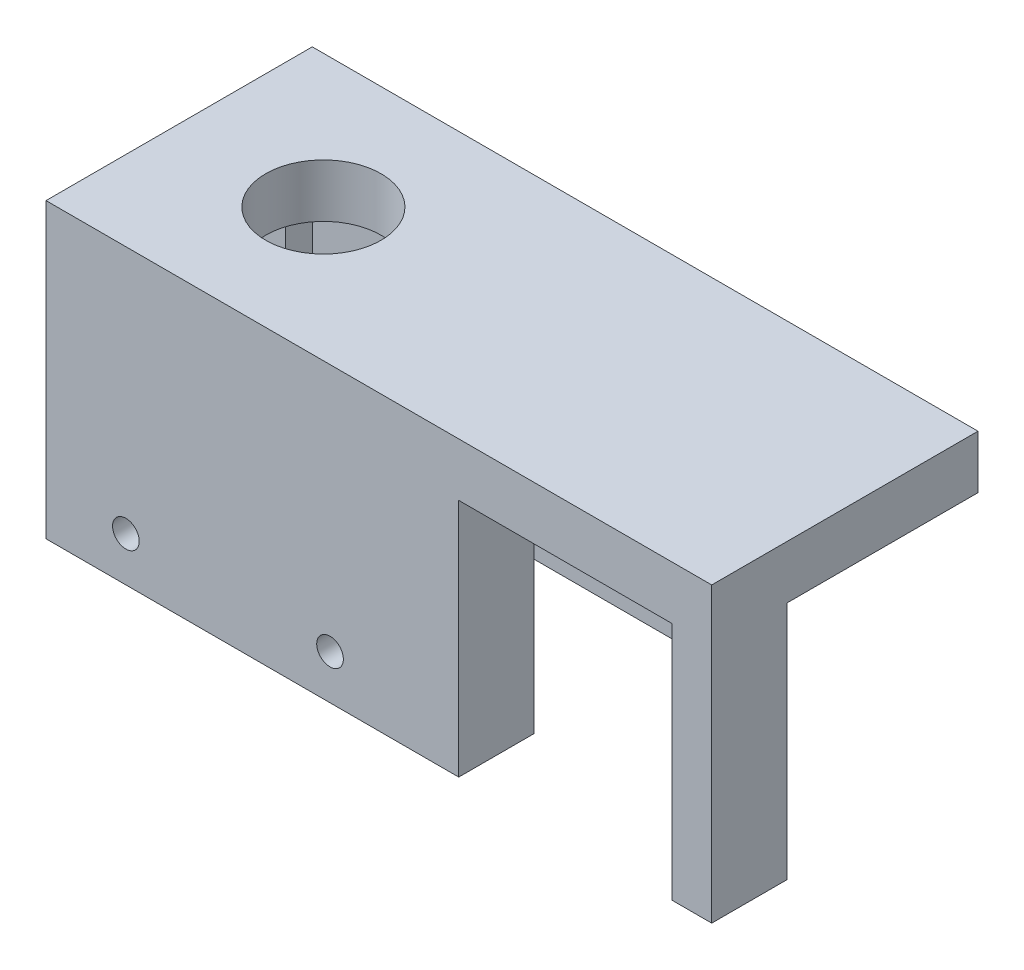
ISO-10303-21;
HEADER;
FILE_DESCRIPTION(('STEP AP214'),'2;1');
FILE_NAME('part.step','',(''),(''),'','','');
FILE_SCHEMA(('AUTOMOTIVE_DESIGN { 1 0 10303 214 1 1 1 1 }'));
ENDSEC;
DATA;
#1=APPLICATION_CONTEXT('core data for automotive mechanical design processes');
#2=APPLICATION_PROTOCOL_DEFINITION('international standard','automotive_design',2000,#1);
#3=PRODUCT_CONTEXT('',#1,'mechanical');
#4=PRODUCT('Part','Part','',(#3));
#5=PRODUCT_RELATED_PRODUCT_CATEGORY('part','',(#4));
#6=PRODUCT_DEFINITION_FORMATION('','',#4);
#7=PRODUCT_DEFINITION_CONTEXT('part definition',#1,'design');
#8=PRODUCT_DEFINITION('design','',#6,#7);
#9=PRODUCT_DEFINITION_SHAPE('','',#8);
#10=(LENGTH_UNIT() NAMED_UNIT(*) SI_UNIT(.MILLI.,.METRE.));
#11=(NAMED_UNIT(*) PLANE_ANGLE_UNIT() SI_UNIT($,.RADIAN.));
#12=(NAMED_UNIT(*) SI_UNIT($,.STERADIAN.) SOLID_ANGLE_UNIT());
#13=UNCERTAINTY_MEASURE_WITH_UNIT(LENGTH_MEASURE(1.E-05),#10,'distance_accuracy_value','');
#14=(GEOMETRIC_REPRESENTATION_CONTEXT(3) GLOBAL_UNCERTAINTY_ASSIGNED_CONTEXT((#13)) GLOBAL_UNIT_ASSIGNED_CONTEXT((#10,
#11,#12)) REPRESENTATION_CONTEXT('',''));
#15=CARTESIAN_POINT('',(0.,0.,0.));
#16=DIRECTION('',(0.,0.,1.));
#17=DIRECTION('',(1.,0.,0.));
#18=AXIS2_PLACEMENT_3D('',#15,#16,#17);
#19=CARTESIAN_POINT('',(0.,-37.342044014566,0.));
#20=DIRECTION('',(0.,1.,0.));
#21=DIRECTION('',(-1.,0.,0.));
#22=AXIS2_PLACEMENT_3D('',#19,#20,#21);
#23=PLANE('',#22);
#24=DIRECTION('',(0.,0.,1.));
#25=VECTOR('',#24,1.);
#26=CARTESIAN_POINT('',(-82.0695949332075,-37.342044014566,-1.79960881896023));
#27=LINE('',#26,#25);
#28=CARTESIAN_POINT('',(-82.0695949332075,-37.342044014566,2.70039118103977));
#29=VERTEX_POINT('',#28);
#30=CARTESIAN_POINT('',(-82.0695949332075,-37.342044014566,5.70039118103978));
#31=VERTEX_POINT('',#30);
#32=EDGE_CURVE('E304',#29,#31,#27,.T.);
#33=ORIENTED_EDGE('',*,*,#32,.T.);
#34=DIRECTION('',(-1.,0.,0.));
#35=VECTOR('',#34,1.);
#36=CARTESIAN_POINT('',(-81.5695949332076,-37.342044014566,5.70039118103978));
#37=LINE('',#36,#35);
#38=CARTESIAN_POINT('',(-86.5695949332075,-37.342044014566,5.70039118103978));
#39=VERTEX_POINT('',#38);
#40=EDGE_CURVE('E287',#31,#39,#37,.T.);
#41=ORIENTED_EDGE('',*,*,#40,.T.);
#42=DIRECTION('',(0.,0.,1.));
#43=VECTOR('',#42,1.);
#44=CARTESIAN_POINT('',(-86.5695949332075,-37.342044014566,-1.79960881896023));
#45=LINE('',#44,#43);
#46=CARTESIAN_POINT('',(-86.5695949332075,-37.342044014566,-1.79960881896023));
#47=VERTEX_POINT('',#46);
#48=EDGE_CURVE('E301',#47,#39,#45,.T.);
#49=ORIENTED_EDGE('',*,*,#48,.F.);
#50=DIRECTION('',(1.,0.,0.));
#51=VECTOR('',#50,1.);
#52=CARTESIAN_POINT('',(-86.5695949332075,-37.342044014566,-1.79960881896023));
#53=LINE('',#52,#51);
#54=CARTESIAN_POINT('',(-38.5695949332075,-37.342044014566,-1.79960881896022));
#55=VERTEX_POINT('',#54);
#56=EDGE_CURVE('E330',#47,#55,#53,.T.);
#57=ORIENTED_EDGE('',*,*,#56,.T.);
#58=DIRECTION('',(0.,0.,1.));
#59=VECTOR('',#58,1.);
#60=CARTESIAN_POINT('',(-38.5695949332075,-37.342044014566,-1.79960881896022));
#61=LINE('',#60,#59);
#62=CARTESIAN_POINT('',(-38.5695949332075,-37.342044014566,2.70039118103978));
#63=VERTEX_POINT('',#62);
#64=EDGE_CURVE('E540',#55,#63,#61,.T.);
#65=ORIENTED_EDGE('',*,*,#64,.T.);
#66=DIRECTION('',(1.,0.,0.));
#67=VECTOR('',#66,1.);
#68=CARTESIAN_POINT('',(-86.5695949332075,-37.342044014566,2.70039118103977));
#69=LINE('',#68,#67);
#70=EDGE_CURVE('E334',#29,#63,#69,.T.);
#71=ORIENTED_EDGE('',*,*,#70,.F.);
#72=EDGE_LOOP('',(#33,#41,#49,#57,#65,#71));
#73=FACE_BOUND('',#72,.T.);
#74=ADVANCED_FACE('F134',(#73),#23,.F.);
#75=CARTESIAN_POINT('',(-11.5695949332076,-10.342044014566,28.2003911810398));
#76=DIRECTION('',(1.,0.,0.));
#77=DIRECTION('',(0.,1.,0.));
#78=AXIS2_PLACEMENT_3D('',#75,#76,#77);
#79=PLANE('',#78);
#80=DIRECTION('',(0.,0.,-1.));
#81=VECTOR('',#80,1.);
#82=CARTESIAN_POINT('',(-11.5695949332076,-4.342044014566,28.2003911810398));
#83=LINE('',#82,#81);
#84=CARTESIAN_POINT('',(-11.5695949332076,-4.342044014566,28.2003911810398));
#85=VERTEX_POINT('',#84);
#86=CARTESIAN_POINT('',(-11.5695949332076,-4.342044014566,-1.79960881896022));
#87=VERTEX_POINT('',#86);
#88=EDGE_CURVE('E384',#85,#87,#83,.T.);
#89=ORIENTED_EDGE('',*,*,#88,.F.);
#90=DIRECTION('',(0.,1.,0.));
#91=VECTOR('',#90,1.);
#92=CARTESIAN_POINT('',(-11.5695949332076,-10.342044014566,28.2003911810398));
#93=LINE('',#92,#91);
#94=CARTESIAN_POINT('',(-11.5695949332075,-37.342044014566,28.2003911810398));
#95=VERTEX_POINT('',#94);
#96=EDGE_CURVE('E416',#95,#85,#93,.T.);
#97=ORIENTED_EDGE('',*,*,#96,.F.);
#98=DIRECTION('',(0.,0.,-1.));
#99=VECTOR('',#98,1.);
#100=CARTESIAN_POINT('',(-11.5695949332075,-37.342044014566,28.2003911810398));
#101=LINE('',#100,#99);
#102=CARTESIAN_POINT('',(-11.5695949332075,-37.342044014566,19.7003911810398));
#103=VERTEX_POINT('',#102);
#104=EDGE_CURVE('E368',#95,#103,#101,.T.);
#105=ORIENTED_EDGE('',*,*,#104,.T.);
#106=DIRECTION('',(0.,1.,0.));
#107=VECTOR('',#106,1.);
#108=CARTESIAN_POINT('',(-11.5695949332075,-37.342044014566,19.7003911810398));
#109=LINE('',#108,#107);
#110=CARTESIAN_POINT('',(-11.5695949332076,-10.342044014566,19.7003911810398));
#111=VERTEX_POINT('',#110);
#112=EDGE_CURVE('E380',#103,#111,#109,.T.);
#113=ORIENTED_EDGE('',*,*,#112,.T.);
#114=DIRECTION('',(0.,0.,-1.));
#115=VECTOR('',#114,1.);
#116=CARTESIAN_POINT('',(-11.5695949332076,-10.342044014566,28.2003911810398));
#117=LINE('',#116,#115);
#118=CARTESIAN_POINT('',(-11.5695949332076,-10.342044014566,-1.79960881896022));
#119=VERTEX_POINT('',#118);
#120=EDGE_CURVE('E392',#111,#119,#117,.T.);
#121=ORIENTED_EDGE('',*,*,#120,.T.);
#122=DIRECTION('',(0.,1.,0.));
#123=VECTOR('',#122,1.);
#124=CARTESIAN_POINT('',(-11.5695949332076,-10.342044014566,-1.79960881896022));
#125=LINE('',#124,#123);
#126=EDGE_CURVE('E403',#119,#87,#125,.T.);
#127=ORIENTED_EDGE('',*,*,#126,.T.);
#128=EDGE_LOOP('',(#89,#97,#105,#113,#121,#127));
#129=FACE_BOUND('',#128,.T.);
#130=ADVANCED_FACE('F136',(#129),#79,.T.);
#131=CARTESIAN_POINT('',(-11.5695949332076,-10.342044014566,28.2003911810398));
#132=DIRECTION('',(0.,0.,-1.));
#133=DIRECTION('',(-1.,0.,0.));
#134=AXIS2_PLACEMENT_3D('',#131,#132,#133);
#135=PLANE('',#134);
#136=CARTESIAN_POINT('',(-54.5695949332075,-32.342044014566,28.2003911810398));
#137=DIRECTION('',(0.,0.,1.));
#138=DIRECTION('',(1.,0.,0.));
#139=AXIS2_PLACEMENT_3D('',#136,#137,#138);
#140=CIRCLE('',#139,1.5);
#141=CARTESIAN_POINT('',(-53.0695949332075,-32.342044014566,28.2003911810398));
#142=VERTEX_POINT('',#141);
#143=EDGE_CURVE('E438',#142,#142,#140,.T.);
#144=ORIENTED_EDGE('',*,*,#143,.F.);
#145=EDGE_LOOP('',(#144));
#146=FACE_BOUND('',#145,.T.);
#147=CARTESIAN_POINT('',(-77.5695949332075,-32.342044014566,28.2003911810398));
#148=DIRECTION('',(0.,0.,1.));
#149=DIRECTION('',(1.,0.,0.));
#150=AXIS2_PLACEMENT_3D('',#147,#148,#149);
#151=CIRCLE('',#150,1.5);
#152=CARTESIAN_POINT('',(-76.0695949332075,-32.342044014566,28.2003911810398));
#153=VERTEX_POINT('',#152);
#154=EDGE_CURVE('E433',#153,#153,#151,.T.);
#155=ORIENTED_EDGE('',*,*,#154,.F.);
#156=EDGE_LOOP('',(#155));
#157=FACE_BOUND('',#156,.T.);
#158=DIRECTION('',(-1.,0.,0.));
#159=VECTOR('',#158,1.);
#160=CARTESIAN_POINT('',(-11.5695949332076,-4.342044014566,28.2003911810398));
#161=LINE('',#160,#159);
#162=CARTESIAN_POINT('',(-86.5695949332076,-4.34204401456603,28.2003911810398));
#163=VERTEX_POINT('',#162);
#164=EDGE_CURVE('E396',#85,#163,#161,.T.);
#165=ORIENTED_EDGE('',*,*,#164,.T.);
#166=DIRECTION('',(0.,1.,0.));
#167=VECTOR('',#166,1.);
#168=CARTESIAN_POINT('',(-86.5695949332076,-10.342044014566,28.2003911810398));
#169=LINE('',#168,#167);
#170=CARTESIAN_POINT('',(-86.5695949332075,-37.342044014566,28.2003911810398));
#171=VERTEX_POINT('',#170);
#172=EDGE_CURVE('E420',#171,#163,#169,.T.);
#173=ORIENTED_EDGE('',*,*,#172,.F.);
#174=DIRECTION('',(1.,0.,0.));
#175=VECTOR('',#174,1.);
#176=CARTESIAN_POINT('',(-86.5695949332075,-37.342044014566,28.2003911810398));
#177=LINE('',#176,#175);
#178=CARTESIAN_POINT('',(-40.0695949332075,-37.342044014566,28.2003911810398));
#179=VERTEX_POINT('',#178);
#180=EDGE_CURVE('E343',#171,#179,#177,.T.);
#181=ORIENTED_EDGE('',*,*,#180,.T.);
#182=DIRECTION('',(0.,1.,0.));
#183=VECTOR('',#182,1.);
#184=CARTESIAN_POINT('',(-40.0695949332075,-37.342044014566,28.2003911810398));
#185=LINE('',#184,#183);
#186=CARTESIAN_POINT('',(-40.0695949332076,-10.342044014566,28.2003911810398));
#187=VERTEX_POINT('',#186);
#188=EDGE_CURVE('E339',#179,#187,#185,.T.);
#189=ORIENTED_EDGE('',*,*,#188,.T.);
#190=DIRECTION('',(-1.,0.,0.));
#191=VECTOR('',#190,1.);
#192=CARTESIAN_POINT('',(-11.5695949332076,-10.342044014566,28.2003911810398));
#193=LINE('',#192,#191);
#194=CARTESIAN_POINT('',(-16.0695949332076,-10.342044014566,28.2003911810398));
#195=VERTEX_POINT('',#194);
#196=EDGE_CURVE('E400',#195,#187,#193,.T.);
#197=ORIENTED_EDGE('',*,*,#196,.F.);
#198=DIRECTION('',(0.,1.,0.));
#199=VECTOR('',#198,1.);
#200=CARTESIAN_POINT('',(-16.0695949332075,-37.342044014566,28.2003911810398));
#201=LINE('',#200,#199);
#202=CARTESIAN_POINT('',(-16.0695949332075,-37.342044014566,28.2003911810398));
#203=VERTEX_POINT('',#202);
#204=EDGE_CURVE('E385',#203,#195,#201,.T.);
#205=ORIENTED_EDGE('',*,*,#204,.F.);
#206=DIRECTION('',(-1.,0.,0.));
#207=VECTOR('',#206,1.);
#208=CARTESIAN_POINT('',(-11.5695949332075,-37.342044014566,28.2003911810398));
#209=LINE('',#208,#207);
#210=EDGE_CURVE('E365',#95,#203,#209,.T.);
#211=ORIENTED_EDGE('',*,*,#210,.F.);
#212=ORIENTED_EDGE('',*,*,#96,.T.);
#213=EDGE_LOOP('',(#165,#173,#181,#189,#197,#205,#211,#212));
#214=FACE_BOUND('',#213,.T.);
#215=ADVANCED_FACE('F584',(#146,#157,#214),#135,.F.);
#216=CARTESIAN_POINT('',(-86.5695949332076,-10.342044014566,28.2003911810398));
#217=DIRECTION('',(1.,0.,0.));
#218=DIRECTION('',(0.,1.,0.));
#219=AXIS2_PLACEMENT_3D('',#216,#217,#218);
#220=PLANE('',#219);
#221=ORIENTED_EDGE('',*,*,#48,.T.);
#222=DIRECTION('',(0.,-1.,0.));
#223=VECTOR('',#222,1.);
#224=CARTESIAN_POINT('',(-86.5695949332075,-37.342044014566,5.70039118103978));
#225=LINE('',#224,#223);
#226=CARTESIAN_POINT('',(-86.5695949332076,-11.342044014566,5.70039118103977));
#227=VERTEX_POINT('',#226);
#228=EDGE_CURVE('E284',#227,#39,#225,.T.);
#229=ORIENTED_EDGE('',*,*,#228,.F.);
#230=DIRECTION('',(0.,0.,-1.));
#231=VECTOR('',#230,1.);
#232=CARTESIAN_POINT('',(-86.5695949332076,-11.342044014566,5.70039118103977));
#233=LINE('',#232,#231);
#234=CARTESIAN_POINT('',(-86.5695949332076,-11.342044014566,20.7003911810398));
#235=VERTEX_POINT('',#234);
#236=EDGE_CURVE('E307',#235,#227,#233,.T.);
#237=ORIENTED_EDGE('',*,*,#236,.F.);
#238=DIRECTION('',(0.,1.,0.));
#239=VECTOR('',#238,1.);
#240=CARTESIAN_POINT('',(-86.5695949332075,-37.342044014566,20.7003911810398));
#241=LINE('',#240,#239);
#242=CARTESIAN_POINT('',(-86.5695949332075,-37.342044014566,20.7003911810398));
#243=VERTEX_POINT('',#242);
#244=EDGE_CURVE('E295',#243,#235,#241,.T.);
#245=ORIENTED_EDGE('',*,*,#244,.F.);
#246=EDGE_CURVE('E315',#243,#171,#45,.T.);
#247=ORIENTED_EDGE('',*,*,#246,.T.);
#248=ORIENTED_EDGE('',*,*,#172,.T.);
#249=DIRECTION('',(0.,0.,-1.));
#250=VECTOR('',#249,1.);
#251=CARTESIAN_POINT('',(-86.5695949332076,-4.34204401456603,28.2003911810398));
#252=LINE('',#251,#250);
#253=CARTESIAN_POINT('',(-86.5695949332076,-4.34204401456603,-1.79960881896023));
#254=VERTEX_POINT('',#253);
#255=EDGE_CURVE('E411',#163,#254,#252,.T.);
#256=ORIENTED_EDGE('',*,*,#255,.T.);
#257=DIRECTION('',(0.,1.,0.));
#258=VECTOR('',#257,1.);
#259=CARTESIAN_POINT('',(-86.5695949332076,-10.342044014566,-1.79960881896023));
#260=LINE('',#259,#258);
#261=EDGE_CURVE('E311',#47,#254,#260,.T.);
#262=ORIENTED_EDGE('',*,*,#261,.F.);
#263=EDGE_LOOP('',(#221,#229,#237,#245,#247,#248,#256,#262));
#264=FACE_BOUND('',#263,.T.);
#265=ADVANCED_FACE('F309',(#264),#220,.F.);
#266=CARTESIAN_POINT('',(-11.5695949332076,-10.342044014566,-1.79960881896022));
#267=DIRECTION('',(0.,0.,-1.));
#268=DIRECTION('',(-1.,0.,0.));
#269=AXIS2_PLACEMENT_3D('',#266,#267,#268);
#270=PLANE('',#269);
#271=CARTESIAN_POINT('',(-77.5695949332075,-32.342044014566,-1.79960881896022));
#272=DIRECTION('',(0.,0.,-1.));
#273=DIRECTION('',(-1.,0.,0.));
#274=AXIS2_PLACEMENT_3D('',#271,#272,#273);
#275=CIRCLE('',#274,1.5);
#276=CARTESIAN_POINT('',(-79.0695949332075,-32.342044014566,-1.79960881896022));
#277=VERTEX_POINT('',#276);
#278=EDGE_CURVE('E466',#277,#277,#275,.T.);
#279=ORIENTED_EDGE('',*,*,#278,.F.);
#280=EDGE_LOOP('',(#279));
#281=FACE_BOUND('',#280,.T.);
#282=DIRECTION('',(-1.,0.,0.));
#283=VECTOR('',#282,1.);
#284=CARTESIAN_POINT('',(-11.5695949332076,-4.342044014566,-1.79960881896022));
#285=LINE('',#284,#283);
#286=EDGE_CURVE('E407',#87,#254,#285,.T.);
#287=ORIENTED_EDGE('',*,*,#286,.F.);
#288=ORIENTED_EDGE('',*,*,#126,.F.);
#289=DIRECTION('',(-1.,0.,0.));
#290=VECTOR('',#289,1.);
#291=CARTESIAN_POINT('',(-11.5695949332076,-10.342044014566,-1.79960881896022));
#292=LINE('',#291,#290);
#293=CARTESIAN_POINT('',(-38.5695949332075,-10.342044014566,-1.79960881896022));
#294=VERTEX_POINT('',#293);
#295=EDGE_CURVE('E395',#119,#294,#292,.T.);
#296=ORIENTED_EDGE('',*,*,#295,.T.);
#297=DIRECTION('',(0.,1.,0.));
#298=VECTOR('',#297,1.);
#299=CARTESIAN_POINT('',(-38.5695949332075,-37.342044014566,-1.79960881896022));
#300=LINE('',#299,#298);
#301=EDGE_CURVE('E326',#55,#294,#300,.T.);
#302=ORIENTED_EDGE('',*,*,#301,.F.);
#303=ORIENTED_EDGE('',*,*,#56,.F.);
#304=ORIENTED_EDGE('',*,*,#261,.T.);
#305=EDGE_LOOP('',(#287,#288,#296,#302,#303,#304));
#306=FACE_BOUND('',#305,.T.);
#307=ADVANCED_FACE('F611',(#281,#306),#270,.T.);
#308=CARTESIAN_POINT('',(0.,-10.342044014566,0.));
#309=DIRECTION('',(0.,1.,0.));
#310=DIRECTION('',(-1.,0.,0.));
#311=AXIS2_PLACEMENT_3D('',#308,#309,#310);
#312=PLANE('',#311);
#313=CARTESIAN_POINT('',(-70.3195949332076,-10.342044014566,13.2003911810398));
#314=DIRECTION('',(0.,1.,0.));
#315=DIRECTION('',(-1.,0.,0.));
#316=AXIS2_PLACEMENT_3D('',#313,#314,#315);
#317=CIRCLE('',#316,6.5);
#318=CARTESIAN_POINT('',(-76.8195949332076,-10.342044014566,13.2003911810398));
#319=VERTEX_POINT('',#318);
#320=EDGE_CURVE('E474',#319,#319,#317,.T.);
#321=ORIENTED_EDGE('',*,*,#320,.T.);
#322=EDGE_LOOP('',(#321));
#323=FACE_BOUND('',#322,.T.);
#324=ORIENTED_EDGE('',*,*,#196,.T.);
#325=DIRECTION('',(0.,0.,-1.));
#326=VECTOR('',#325,1.);
#327=CARTESIAN_POINT('',(-40.0695949332075,-10.342044014566,28.2003911810398));
#328=LINE('',#327,#326);
#329=CARTESIAN_POINT('',(-40.0695949332075,-10.342044014566,19.7003911810398));
#330=VERTEX_POINT('',#329);
#331=EDGE_CURVE('E519',#187,#330,#328,.T.);
#332=ORIENTED_EDGE('',*,*,#331,.T.);
#333=DIRECTION('',(1.,0.,0.));
#334=VECTOR('',#333,1.);
#335=CARTESIAN_POINT('',(-46.0695949332076,-10.342044014566,19.7003911810398));
#336=LINE('',#335,#334);
#337=CARTESIAN_POINT('',(-46.0695949332076,-10.342044014566,19.7003911810398));
#338=VERTEX_POINT('',#337);
#339=EDGE_CURVE('E376',#338,#330,#336,.T.);
#340=ORIENTED_EDGE('',*,*,#339,.F.);
#341=DIRECTION('',(0.,0.,-1.));
#342=VECTOR('',#341,1.);
#343=CARTESIAN_POINT('',(-46.0695949332076,-10.342044014566,28.2003911810398));
#344=LINE('',#343,#342);
#345=CARTESIAN_POINT('',(-46.0695949332076,-10.342044014566,23.7003911810398));
#346=VERTEX_POINT('',#345);
#347=EDGE_CURVE('E515',#346,#338,#344,.T.);
#348=ORIENTED_EDGE('',*,*,#347,.F.);
#349=DIRECTION('',(1.,0.,0.));
#350=VECTOR('',#349,1.);
#351=CARTESIAN_POINT('',(-86.5695949332076,-10.342044014566,23.7003911810398));
#352=LINE('',#351,#350);
#353=CARTESIAN_POINT('',(-82.0695949332076,-10.342044014566,23.7003911810398));
#354=VERTEX_POINT('',#353);
#355=EDGE_CURVE('E345',#354,#346,#352,.T.);
#356=ORIENTED_EDGE('',*,*,#355,.F.);
#357=DIRECTION('',(0.,0.,1.));
#358=VECTOR('',#357,1.);
#359=CARTESIAN_POINT('',(-82.0695949332076,-10.342044014566,-1.79960881896023));
#360=LINE('',#359,#358);
#361=CARTESIAN_POINT('',(-82.0695949332076,-10.342044014566,2.70039118103977));
#362=VERTEX_POINT('',#361);
#363=EDGE_CURVE('E322',#362,#354,#360,.T.);
#364=ORIENTED_EDGE('',*,*,#363,.F.);
#365=DIRECTION('',(1.,0.,0.));
#366=VECTOR('',#365,1.);
#367=CARTESIAN_POINT('',(-86.5695949332076,-10.342044014566,2.70039118103977));
#368=LINE('',#367,#366);
#369=CARTESIAN_POINT('',(-43.5695949332075,-10.342044014566,2.70039118103978));
#370=VERTEX_POINT('',#369);
#371=EDGE_CURVE('E320',#362,#370,#368,.T.);
#372=ORIENTED_EDGE('',*,*,#371,.T.);
#373=DIRECTION('',(0.,0.,1.));
#374=VECTOR('',#373,1.);
#375=CARTESIAN_POINT('',(-43.5695949332075,-10.342044014566,-1.79960881896022));
#376=LINE('',#375,#374);
#377=CARTESIAN_POINT('',(-43.5695949332075,-10.342044014566,7.20039118103978));
#378=VERTEX_POINT('',#377);
#379=EDGE_CURVE('E545',#370,#378,#376,.T.);
#380=ORIENTED_EDGE('',*,*,#379,.T.);
#381=DIRECTION('',(-1.,0.,0.));
#382=VECTOR('',#381,1.);
#383=CARTESIAN_POINT('',(-38.5695949332075,-10.342044014566,7.20039118103978));
#384=LINE('',#383,#382);
#385=CARTESIAN_POINT('',(-38.5695949332075,-10.342044014566,7.20039118103978));
#386=VERTEX_POINT('',#385);
#387=EDGE_CURVE('E510',#386,#378,#384,.T.);
#388=ORIENTED_EDGE('',*,*,#387,.F.);
#389=DIRECTION('',(0.,0.,1.));
#390=VECTOR('',#389,1.);
#391=CARTESIAN_POINT('',(-38.5695949332075,-10.342044014566,-1.79960881896022));
#392=LINE('',#391,#390);
#393=EDGE_CURVE('E541',#294,#386,#392,.T.);
#394=ORIENTED_EDGE('',*,*,#393,.F.);
#395=ORIENTED_EDGE('',*,*,#295,.F.);
#396=ORIENTED_EDGE('',*,*,#120,.F.);
#397=DIRECTION('',(-1.,0.,0.));
#398=VECTOR('',#397,1.);
#399=CARTESIAN_POINT('',(-11.5695949332076,-10.342044014566,19.7003911810398));
#400=LINE('',#399,#398);
#401=CARTESIAN_POINT('',(-16.0695949332076,-10.342044014566,19.7003911810398));
#402=VERTEX_POINT('',#401);
#403=EDGE_CURVE('E373',#111,#402,#400,.T.);
#404=ORIENTED_EDGE('',*,*,#403,.T.);
#405=DIRECTION('',(0.,0.,-1.));
#406=VECTOR('',#405,1.);
#407=CARTESIAN_POINT('',(-16.0695949332076,-10.342044014566,28.2003911810398));
#408=LINE('',#407,#406);
#409=EDGE_CURVE('E362',#195,#402,#408,.T.);
#410=ORIENTED_EDGE('',*,*,#409,.F.);
#411=EDGE_LOOP('',(#324,#332,#340,#348,#356,#364,#372,#380,#388,#394,#395,#396,#404,#410));
#412=FACE_BOUND('',#411,.T.);
#413=ADVANCED_FACE('F567',(#323,#412),#312,.F.);
#414=CARTESIAN_POINT('',(0.,-4.342044014566,0.));
#415=DIRECTION('',(0.,1.,0.));
#416=DIRECTION('',(-1.,0.,0.));
#417=AXIS2_PLACEMENT_3D('',#414,#415,#416);
#418=PLANE('',#417);
#419=CARTESIAN_POINT('',(-70.3195949332076,-4.34204401456602,13.2003911810398));
#420=DIRECTION('',(0.,1.,0.));
#421=DIRECTION('',(-1.,0.,0.));
#422=AXIS2_PLACEMENT_3D('',#419,#420,#421);
#423=CIRCLE('',#422,6.5);
#424=CARTESIAN_POINT('',(-76.8195949332076,-4.34204401456602,13.2003911810398));
#425=VERTEX_POINT('',#424);
#426=EDGE_CURVE('E470',#425,#425,#423,.T.);
#427=ORIENTED_EDGE('',*,*,#426,.F.);
#428=EDGE_LOOP('',(#427));
#429=FACE_BOUND('',#428,.T.);
#430=ORIENTED_EDGE('',*,*,#88,.T.);
#431=ORIENTED_EDGE('',*,*,#286,.T.);
#432=ORIENTED_EDGE('',*,*,#255,.F.);
#433=ORIENTED_EDGE('',*,*,#164,.F.);
#434=EDGE_LOOP('',(#430,#431,#432,#433));
#435=FACE_BOUND('',#434,.T.);
#436=ADVANCED_FACE('F606',(#429,#435),#418,.T.);
#437=CARTESIAN_POINT('',(-11.5695949332075,-37.342044014566,19.7003911810398));
#438=DIRECTION('',(0.,0.,-1.));
#439=DIRECTION('',(0.,1.,0.));
#440=AXIS2_PLACEMENT_3D('',#437,#438,#439);
#441=PLANE('',#440);
#442=ORIENTED_EDGE('',*,*,#403,.F.);
#443=ORIENTED_EDGE('',*,*,#112,.F.);
#444=DIRECTION('',(-1.,0.,0.));
#445=VECTOR('',#444,1.);
#446=CARTESIAN_POINT('',(-11.5695949332075,-37.342044014566,19.7003911810398));
#447=LINE('',#446,#445);
#448=CARTESIAN_POINT('',(-16.0695949332075,-37.342044014566,19.7003911810398));
#449=VERTEX_POINT('',#448);
#450=EDGE_CURVE('E357',#103,#449,#447,.T.);
#451=ORIENTED_EDGE('',*,*,#450,.T.);
#452=DIRECTION('',(0.,1.,0.));
#453=VECTOR('',#452,1.);
#454=CARTESIAN_POINT('',(-16.0695949332075,-37.342044014566,19.7003911810398));
#455=LINE('',#454,#453);
#456=EDGE_CURVE('E372',#449,#402,#455,.T.);
#457=ORIENTED_EDGE('',*,*,#456,.T.);
#458=EDGE_LOOP('',(#442,#443,#451,#457));
#459=FACE_BOUND('',#458,.T.);
#460=ADVANCED_FACE('F774',(#459),#441,.T.);
#461=CARTESIAN_POINT('',(-16.0695949332075,-37.342044014566,28.2003911810398));
#462=DIRECTION('',(1.,0.,0.));
#463=DIRECTION('',(0.,1.,0.));
#464=AXIS2_PLACEMENT_3D('',#461,#462,#463);
#465=PLANE('',#464);
#466=ORIENTED_EDGE('',*,*,#409,.T.);
#467=ORIENTED_EDGE('',*,*,#456,.F.);
#468=DIRECTION('',(0.,0.,-1.));
#469=VECTOR('',#468,1.);
#470=CARTESIAN_POINT('',(-16.0695949332075,-37.342044014566,28.2003911810398));
#471=LINE('',#470,#469);
#472=EDGE_CURVE('E361',#203,#449,#471,.T.);
#473=ORIENTED_EDGE('',*,*,#472,.F.);
#474=ORIENTED_EDGE('',*,*,#204,.T.);
#475=EDGE_LOOP('',(#466,#467,#473,#474));
#476=FACE_BOUND('',#475,.T.);
#477=ADVANCED_FACE('F597',(#476),#465,.F.);
#478=CARTESIAN_POINT('',(0.,-37.342044014566,0.));
#479=DIRECTION('',(0.,-1.,0.));
#480=DIRECTION('',(1.,0.,0.));
#481=AXIS2_PLACEMENT_3D('',#478,#479,#480);
#482=PLANE('',#481);
#483=ORIENTED_EDGE('',*,*,#450,.F.);
#484=ORIENTED_EDGE('',*,*,#104,.F.);
#485=ORIENTED_EDGE('',*,*,#210,.T.);
#486=ORIENTED_EDGE('',*,*,#472,.T.);
#487=EDGE_LOOP('',(#483,#484,#485,#486));
#488=FACE_BOUND('',#487,.T.);
#489=ADVANCED_FACE('F601',(#488),#482,.T.);
#490=ORIENTED_EDGE('',*,*,#246,.F.);
#491=DIRECTION('',(-1.,0.,0.));
#492=VECTOR('',#491,1.);
#493=CARTESIAN_POINT('',(-81.5695949332076,-37.342044014566,20.7003911810398));
#494=LINE('',#493,#492);
#495=CARTESIAN_POINT('',(-82.0695949332075,-37.342044014566,20.7003911810398));
#496=VERTEX_POINT('',#495);
#497=EDGE_CURVE('E306',#496,#243,#494,.T.);
#498=ORIENTED_EDGE('',*,*,#497,.F.);
#499=CARTESIAN_POINT('',(-82.0695949332075,-37.342044014566,23.7003911810398));
#500=VERTEX_POINT('',#499);
#501=EDGE_CURVE('E314',#496,#500,#27,.T.);
#502=ORIENTED_EDGE('',*,*,#501,.T.);
#503=DIRECTION('',(1.,0.,0.));
#504=VECTOR('',#503,1.);
#505=CARTESIAN_POINT('',(-86.5695949332075,-37.342044014566,23.7003911810398));
#506=LINE('',#505,#504);
#507=CARTESIAN_POINT('',(-46.0695949332076,-37.342044014566,23.7003911810398));
#508=VERTEX_POINT('',#507);
#509=EDGE_CURVE('E350',#500,#508,#506,.T.);
#510=ORIENTED_EDGE('',*,*,#509,.T.);
#511=DIRECTION('',(0.,0.,-1.));
#512=VECTOR('',#511,1.);
#513=CARTESIAN_POINT('',(-46.0695949332075,-37.342044014566,28.2003911810398));
#514=LINE('',#513,#512);
#515=CARTESIAN_POINT('',(-46.0695949332075,-37.342044014566,19.7003911810398));
#516=VERTEX_POINT('',#515);
#517=EDGE_CURVE('E514',#508,#516,#514,.T.);
#518=ORIENTED_EDGE('',*,*,#517,.T.);
#519=DIRECTION('',(1.,0.,0.));
#520=VECTOR('',#519,1.);
#521=CARTESIAN_POINT('',(-46.0695949332075,-37.342044014566,19.7003911810398));
#522=LINE('',#521,#520);
#523=CARTESIAN_POINT('',(-40.0695949332075,-37.342044014566,19.7003911810398));
#524=VERTEX_POINT('',#523);
#525=EDGE_CURVE('E520',#516,#524,#522,.T.);
#526=ORIENTED_EDGE('',*,*,#525,.T.);
#527=DIRECTION('',(0.,0.,-1.));
#528=VECTOR('',#527,1.);
#529=CARTESIAN_POINT('',(-40.0695949332075,-37.342044014566,28.2003911810398));
#530=LINE('',#529,#528);
#531=EDGE_CURVE('E528',#179,#524,#530,.T.);
#532=ORIENTED_EDGE('',*,*,#531,.F.);
#533=ORIENTED_EDGE('',*,*,#180,.F.);
#534=EDGE_LOOP('',(#490,#498,#502,#510,#518,#526,#532,#533));
#535=FACE_BOUND('',#534,.T.);
#536=ADVANCED_FACE('F573',(#535),#23,.F.);
#537=CARTESIAN_POINT('',(-40.0695949332075,-37.342044014566,28.2003911810398));
#538=DIRECTION('',(1.,0.,0.));
#539=DIRECTION('',(0.,1.,0.));
#540=AXIS2_PLACEMENT_3D('',#537,#538,#539);
#541=PLANE('',#540);
#542=ORIENTED_EDGE('',*,*,#331,.F.);
#543=ORIENTED_EDGE('',*,*,#188,.F.);
#544=ORIENTED_EDGE('',*,*,#531,.T.);
#545=DIRECTION('',(0.,1.,0.));
#546=VECTOR('',#545,1.);
#547=CARTESIAN_POINT('',(-40.0695949332075,-37.342044014566,19.7003911810398));
#548=LINE('',#547,#546);
#549=EDGE_CURVE('E505',#524,#330,#548,.T.);
#550=ORIENTED_EDGE('',*,*,#549,.T.);
#551=EDGE_LOOP('',(#542,#543,#544,#550));
#552=FACE_BOUND('',#551,.T.);
#553=ADVANCED_FACE('F591',(#552),#541,.T.);
#554=CARTESIAN_POINT('',(-86.5695949332075,-37.342044014566,23.7003911810398));
#555=DIRECTION('',(0.,0.,1.));
#556=DIRECTION('',(1.,0.,0.));
#557=AXIS2_PLACEMENT_3D('',#554,#555,#556);
#558=PLANE('',#557);
#559=CARTESIAN_POINT('',(-54.5695949332075,-32.342044014566,23.7003911810398));
#560=DIRECTION('',(0.,0.,1.));
#561=DIRECTION('',(1.,0.,0.));
#562=AXIS2_PLACEMENT_3D('',#559,#560,#561);
#563=CIRCLE('',#562,1.5);
#564=CARTESIAN_POINT('',(-53.0695949332075,-32.342044014566,23.7003911810398));
#565=VERTEX_POINT('',#564);
#566=EDGE_CURVE('E434',#565,#565,#563,.T.);
#567=ORIENTED_EDGE('',*,*,#566,.T.);
#568=EDGE_LOOP('',(#567));
#569=FACE_BOUND('',#568,.T.);
#570=CARTESIAN_POINT('',(-77.5695949332075,-32.342044014566,23.7003911810398));
#571=DIRECTION('',(0.,0.,1.));
#572=DIRECTION('',(1.,0.,0.));
#573=AXIS2_PLACEMENT_3D('',#570,#571,#572);
#574=CIRCLE('',#573,1.5);
#575=CARTESIAN_POINT('',(-76.0695949332075,-32.342044014566,23.7003911810398));
#576=VERTEX_POINT('',#575);
#577=EDGE_CURVE('E432',#576,#576,#574,.T.);
#578=ORIENTED_EDGE('',*,*,#577,.T.);
#579=EDGE_LOOP('',(#578));
#580=FACE_BOUND('',#579,.T.);
#581=DIRECTION('',(0.,-1.,0.));
#582=VECTOR('',#581,1.);
#583=CARTESIAN_POINT('',(-82.0695949332075,-37.342044014566,23.7003911810398));
#584=LINE('',#583,#582);
#585=EDGE_CURVE('E493',#354,#500,#584,.T.);
#586=ORIENTED_EDGE('',*,*,#585,.F.);
#587=ORIENTED_EDGE('',*,*,#355,.T.);
#588=DIRECTION('',(0.,1.,0.));
#589=VECTOR('',#588,1.);
#590=CARTESIAN_POINT('',(-46.0695949332075,-37.342044014566,23.7003911810398));
#591=LINE('',#590,#589);
#592=EDGE_CURVE('E344',#508,#346,#591,.T.);
#593=ORIENTED_EDGE('',*,*,#592,.F.);
#594=ORIENTED_EDGE('',*,*,#509,.F.);
#595=EDGE_LOOP('',(#586,#587,#593,#594));
#596=FACE_BOUND('',#595,.T.);
#597=ADVANCED_FACE('F569',(#569,#580,#596),#558,.F.);
#598=CARTESIAN_POINT('',(-46.0695949332075,-37.342044014566,19.7003911810398));
#599=DIRECTION('',(0.,0.,1.));
#600=DIRECTION('',(0.,-1.,0.));
#601=AXIS2_PLACEMENT_3D('',#598,#599,#600);
#602=PLANE('',#601);
#603=ORIENTED_EDGE('',*,*,#339,.T.);
#604=ORIENTED_EDGE('',*,*,#549,.F.);
#605=ORIENTED_EDGE('',*,*,#525,.F.);
#606=DIRECTION('',(0.,1.,0.));
#607=VECTOR('',#606,1.);
#608=CARTESIAN_POINT('',(-46.0695949332075,-37.342044014566,19.7003911810398));
#609=LINE('',#608,#607);
#610=EDGE_CURVE('E509',#516,#338,#609,.T.);
#611=ORIENTED_EDGE('',*,*,#610,.T.);
#612=EDGE_LOOP('',(#603,#604,#605,#611));
#613=FACE_BOUND('',#612,.T.);
#614=ADVANCED_FACE('F657',(#613),#602,.F.);
#615=CARTESIAN_POINT('',(-46.0695949332075,-37.342044014566,28.2003911810398));
#616=DIRECTION('',(1.,0.,0.));
#617=DIRECTION('',(0.,1.,0.));
#618=AXIS2_PLACEMENT_3D('',#615,#616,#617);
#619=PLANE('',#618);
#620=ORIENTED_EDGE('',*,*,#517,.F.);
#621=ORIENTED_EDGE('',*,*,#592,.T.);
#622=ORIENTED_EDGE('',*,*,#347,.T.);
#623=ORIENTED_EDGE('',*,*,#610,.F.);
#624=EDGE_LOOP('',(#620,#621,#622,#623));
#625=FACE_BOUND('',#624,.T.);
#626=ADVANCED_FACE('F663',(#625),#619,.F.);
#627=CARTESIAN_POINT('',(-38.5695949332075,-37.342044014566,-1.79960881896022));
#628=DIRECTION('',(-1.,0.,0.));
#629=DIRECTION('',(0.,-1.,0.));
#630=AXIS2_PLACEMENT_3D('',#627,#628,#629);
#631=PLANE('',#630);
#632=DIRECTION('',(0.,1.,0.));
#633=VECTOR('',#632,1.);
#634=CARTESIAN_POINT('',(-38.5695949332075,-37.342044014566,7.20039118103978));
#635=LINE('',#634,#633);
#636=CARTESIAN_POINT('',(-38.5695949332075,-22.342044014566,7.20039118103978));
#637=VERTEX_POINT('',#636);
#638=EDGE_CURVE('E537',#637,#386,#635,.T.);
#639=ORIENTED_EDGE('',*,*,#638,.F.);
#640=DIRECTION('',(0.,0.,1.));
#641=VECTOR('',#640,1.);
#642=CARTESIAN_POINT('',(-38.5695949332075,-22.342044014566,7.20039118103978));
#643=LINE('',#642,#641);
#644=CARTESIAN_POINT('',(-38.5695949332075,-22.342044014566,2.70039118103978));
#645=VERTEX_POINT('',#644);
#646=EDGE_CURVE('E481',#645,#637,#643,.T.);
#647=ORIENTED_EDGE('',*,*,#646,.F.);
#648=DIRECTION('',(0.,1.,0.));
#649=VECTOR('',#648,1.);
#650=CARTESIAN_POINT('',(-38.5695949332075,-37.342044014566,2.70039118103978));
#651=LINE('',#650,#649);
#652=EDGE_CURVE('E478',#63,#645,#651,.T.);
#653=ORIENTED_EDGE('',*,*,#652,.F.);
#654=ORIENTED_EDGE('',*,*,#64,.F.);
#655=ORIENTED_EDGE('',*,*,#301,.T.);
#656=ORIENTED_EDGE('',*,*,#393,.T.);
#657=EDGE_LOOP('',(#639,#647,#653,#654,#655,#656));
#658=FACE_BOUND('',#657,.T.);
#659=ADVANCED_FACE('F557',(#658),#631,.F.);
#660=CARTESIAN_POINT('',(-38.5695949332075,-37.342044014566,7.20039118103978));
#661=DIRECTION('',(0.,0.,-1.));
#662=DIRECTION('',(-1.,0.,0.));
#663=AXIS2_PLACEMENT_3D('',#660,#661,#662);
#664=PLANE('',#663);
#665=DIRECTION('',(0.,1.,0.));
#666=VECTOR('',#665,1.);
#667=CARTESIAN_POINT('',(-43.5695949332075,-37.342044014566,7.20039118103978));
#668=LINE('',#667,#666);
#669=CARTESIAN_POINT('',(-43.5695949332075,-22.342044014566,7.20039118103978));
#670=VERTEX_POINT('',#669);
#671=EDGE_CURVE('E534',#670,#378,#668,.T.);
#672=ORIENTED_EDGE('',*,*,#671,.F.);
#673=DIRECTION('',(1.,0.,0.));
#674=VECTOR('',#673,1.);
#675=CARTESIAN_POINT('',(-44.5695949332075,-22.342044014566,7.20039118103978));
#676=LINE('',#675,#674);
#677=EDGE_CURVE('E484',#670,#637,#676,.T.);
#678=ORIENTED_EDGE('',*,*,#677,.T.);
#679=ORIENTED_EDGE('',*,*,#638,.T.);
#680=ORIENTED_EDGE('',*,*,#387,.T.);
#681=EDGE_LOOP('',(#672,#678,#679,#680));
#682=FACE_BOUND('',#681,.T.);
#683=ADVANCED_FACE('F615',(#682),#664,.F.);
#684=CARTESIAN_POINT('',(-43.5695949332075,-37.342044014566,-1.79960881896022));
#685=DIRECTION('',(-1.,0.,0.));
#686=DIRECTION('',(0.,-1.,0.));
#687=AXIS2_PLACEMENT_3D('',#684,#685,#686);
#688=PLANE('',#687);
#689=DIRECTION('',(0.,0.,-1.));
#690=VECTOR('',#689,1.);
#691=CARTESIAN_POINT('',(-43.5695949332075,-22.342044014566,-1.79960881896022));
#692=LINE('',#691,#690);
#693=CARTESIAN_POINT('',(-43.5695949332075,-22.342044014566,2.70039118103978));
#694=VERTEX_POINT('',#693);
#695=EDGE_CURVE('E488',#670,#694,#692,.T.);
#696=ORIENTED_EDGE('',*,*,#695,.F.);
#697=ORIENTED_EDGE('',*,*,#671,.T.);
#698=ORIENTED_EDGE('',*,*,#379,.F.);
#699=DIRECTION('',(0.,-1.,0.));
#700=VECTOR('',#699,1.);
#701=CARTESIAN_POINT('',(-43.5695949332075,-37.342044014566,2.70039118103978));
#702=LINE('',#701,#700);
#703=EDGE_CURVE('E331',#370,#694,#702,.T.);
#704=ORIENTED_EDGE('',*,*,#703,.T.);
#705=EDGE_LOOP('',(#696,#697,#698,#704));
#706=FACE_BOUND('',#705,.T.);
#707=ADVANCED_FACE('F620',(#706),#688,.T.);
#708=CARTESIAN_POINT('',(-86.5695949332075,-37.342044014566,2.70039118103977));
#709=DIRECTION('',(0.,0.,1.));
#710=DIRECTION('',(1.,0.,0.));
#711=AXIS2_PLACEMENT_3D('',#708,#709,#710);
#712=PLANE('',#711);
#713=CARTESIAN_POINT('',(-77.5695949332075,-32.342044014566,2.70039118103977));
#714=DIRECTION('',(0.,0.,1.));
#715=DIRECTION('',(1.,0.,0.));
#716=AXIS2_PLACEMENT_3D('',#713,#714,#715);
#717=CIRCLE('',#716,1.5);
#718=CARTESIAN_POINT('',(-76.0695949332075,-32.342044014566,2.70039118103977));
#719=VERTEX_POINT('',#718);
#720=EDGE_CURVE('E428',#719,#719,#717,.T.);
#721=ORIENTED_EDGE('',*,*,#720,.F.);
#722=EDGE_LOOP('',(#721));
#723=FACE_BOUND('',#722,.T.);
#724=ORIENTED_EDGE('',*,*,#70,.T.);
#725=ORIENTED_EDGE('',*,*,#652,.T.);
#726=DIRECTION('',(1.,0.,0.));
#727=VECTOR('',#726,1.);
#728=CARTESIAN_POINT('',(-44.5695949332075,-22.342044014566,2.70039118103978));
#729=LINE('',#728,#727);
#730=EDGE_CURVE('E158',#694,#645,#729,.T.);
#731=ORIENTED_EDGE('',*,*,#730,.F.);
#732=ORIENTED_EDGE('',*,*,#703,.F.);
#733=ORIENTED_EDGE('',*,*,#371,.F.);
#734=DIRECTION('',(0.,-1.,0.));
#735=VECTOR('',#734,1.);
#736=CARTESIAN_POINT('',(-82.0695949332075,-37.342044014566,2.70039118103977));
#737=LINE('',#736,#735);
#738=EDGE_CURVE('E349',#362,#29,#737,.T.);
#739=ORIENTED_EDGE('',*,*,#738,.T.);
#740=EDGE_LOOP('',(#724,#725,#731,#732,#733,#739));
#741=FACE_BOUND('',#740,.T.);
#742=ADVANCED_FACE('F559',(#723,#741),#712,.T.);
#743=CARTESIAN_POINT('',(-82.0695949332075,-37.342044014566,-1.79960881896023));
#744=DIRECTION('',(-1.,0.,0.));
#745=DIRECTION('',(0.,-1.,0.));
#746=AXIS2_PLACEMENT_3D('',#743,#744,#745);
#747=PLANE('',#746);
#748=DIRECTION('',(0.,0.,-1.));
#749=VECTOR('',#748,1.);
#750=CARTESIAN_POINT('',(-82.0695949332076,-11.342044014566,-1.79960881896023));
#751=LINE('',#750,#749);
#752=CARTESIAN_POINT('',(-82.0695949332076,-11.342044014566,20.7003911810398));
#753=VERTEX_POINT('',#752);
#754=CARTESIAN_POINT('',(-82.0695949332076,-11.342044014566,5.70039118103977));
#755=VERTEX_POINT('',#754);
#756=EDGE_CURVE('E143',#753,#755,#751,.T.);
#757=ORIENTED_EDGE('',*,*,#756,.T.);
#758=DIRECTION('',(0.,-1.,0.));
#759=VECTOR('',#758,1.);
#760=CARTESIAN_POINT('',(-82.0695949332075,-37.342044014566,5.70039118103978));
#761=LINE('',#760,#759);
#762=EDGE_CURVE('E12',#755,#31,#761,.T.);
#763=ORIENTED_EDGE('',*,*,#762,.T.);
#764=ORIENTED_EDGE('',*,*,#32,.F.);
#765=ORIENTED_EDGE('',*,*,#738,.F.);
#766=ORIENTED_EDGE('',*,*,#363,.T.);
#767=ORIENTED_EDGE('',*,*,#585,.T.);
#768=ORIENTED_EDGE('',*,*,#501,.F.);
#769=DIRECTION('',(0.,1.,0.));
#770=VECTOR('',#769,1.);
#771=CARTESIAN_POINT('',(-82.0695949332075,-37.342044014566,20.7003911810398));
#772=LINE('',#771,#770);
#773=EDGE_CURVE('E419',#496,#753,#772,.T.);
#774=ORIENTED_EDGE('',*,*,#773,.T.);
#775=EDGE_LOOP('',(#757,#763,#764,#765,#766,#767,#768,#774));
#776=FACE_BOUND('',#775,.T.);
#777=ADVANCED_FACE('F444',(#776),#747,.F.);
#778=CARTESIAN_POINT('',(-44.5695949332075,-22.342044014566,7.20039118103978));
#779=DIRECTION('',(0.,1.,0.));
#780=DIRECTION('',(-1.,0.,0.));
#781=AXIS2_PLACEMENT_3D('',#778,#779,#780);
#782=PLANE('',#781);
#783=ORIENTED_EDGE('',*,*,#695,.T.);
#784=ORIENTED_EDGE('',*,*,#730,.T.);
#785=ORIENTED_EDGE('',*,*,#646,.T.);
#786=ORIENTED_EDGE('',*,*,#677,.F.);
#787=EDGE_LOOP('',(#783,#784,#785,#786));
#788=FACE_BOUND('',#787,.T.);
#789=ADVANCED_FACE('F618',(#788),#782,.F.);
#790=CARTESIAN_POINT('',(-70.3195949332075,-34.342044014566,13.2003911810398));
#791=DIRECTION('',(0.,1.,0.));
#792=DIRECTION('',(-1.,0.,0.));
#793=AXIS2_PLACEMENT_3D('',#790,#791,#792);
#794=CYLINDRICAL_SURFACE('',#793,6.5);
#795=ORIENTED_EDGE('',*,*,#426,.T.);
#796=EDGE_LOOP('',(#795));
#797=FACE_BOUND('',#796,.T.);
#798=ORIENTED_EDGE('',*,*,#320,.F.);
#799=EDGE_LOOP('',(#798));
#800=FACE_BOUND('',#799,.T.);
#801=ADVANCED_FACE('F649',(#797,#800),#794,.F.);
#802=CARTESIAN_POINT('',(-77.5695949332075,-32.342044014566,-21.7996088189602));
#803=DIRECTION('',(0.,0.,1.));
#804=DIRECTION('',(1.,0.,0.));
#805=AXIS2_PLACEMENT_3D('',#802,#803,#804);
#806=CYLINDRICAL_SURFACE('',#805,1.5);
#807=ORIENTED_EDGE('',*,*,#278,.T.);
#808=EDGE_LOOP('',(#807));
#809=FACE_BOUND('',#808,.T.);
#810=ORIENTED_EDGE('',*,*,#720,.T.);
#811=EDGE_LOOP('',(#810));
#812=FACE_BOUND('',#811,.T.);
#813=ADVANCED_FACE('F673',(#809,#812),#806,.F.);
#814=ORIENTED_EDGE('',*,*,#154,.T.);
#815=EDGE_LOOP('',(#814));
#816=FACE_BOUND('',#815,.T.);
#817=ORIENTED_EDGE('',*,*,#577,.F.);
#818=EDGE_LOOP('',(#817));
#819=FACE_BOUND('',#818,.T.);
#820=ADVANCED_FACE('F670',(#816,#819),#806,.F.);
#821=CARTESIAN_POINT('',(-54.5695949332075,-32.342044014566,18.2003911810398));
#822=DIRECTION('',(0.,0.,1.));
#823=DIRECTION('',(1.,0.,0.));
#824=AXIS2_PLACEMENT_3D('',#821,#822,#823);
#825=CYLINDRICAL_SURFACE('',#824,1.5);
#826=ORIENTED_EDGE('',*,*,#143,.T.);
#827=EDGE_LOOP('',(#826));
#828=FACE_BOUND('',#827,.T.);
#829=ORIENTED_EDGE('',*,*,#566,.F.);
#830=EDGE_LOOP('',(#829));
#831=FACE_BOUND('',#830,.T.);
#832=ADVANCED_FACE('F672',(#828,#831),#825,.F.);
#833=CARTESIAN_POINT('',(-81.5695949332076,-37.342044014566,5.70039118103978));
#834=DIRECTION('',(0.,0.,-1.));
#835=DIRECTION('',(0.,1.,0.));
#836=AXIS2_PLACEMENT_3D('',#833,#834,#835);
#837=PLANE('',#836);
#838=DIRECTION('',(-1.,0.,0.));
#839=VECTOR('',#838,1.);
#840=CARTESIAN_POINT('',(-81.5695949332076,-11.342044014566,5.70039118103977));
#841=LINE('',#840,#839);
#842=EDGE_CURVE('E289',#755,#227,#841,.T.);
#843=ORIENTED_EDGE('',*,*,#842,.T.);
#844=ORIENTED_EDGE('',*,*,#228,.T.);
#845=ORIENTED_EDGE('',*,*,#40,.F.);
#846=ORIENTED_EDGE('',*,*,#762,.F.);
#847=EDGE_LOOP('',(#843,#844,#845,#846));
#848=FACE_BOUND('',#847,.T.);
#849=ADVANCED_FACE('F286',(#848),#837,.F.);
#850=CARTESIAN_POINT('',(-81.5695949332076,-11.342044014566,5.70039118103977));
#851=DIRECTION('',(0.,1.,0.));
#852=DIRECTION('',(-1.,0.,0.));
#853=AXIS2_PLACEMENT_3D('',#850,#851,#852);
#854=PLANE('',#853);
#855=DIRECTION('',(-1.,0.,0.));
#856=VECTOR('',#855,1.);
#857=CARTESIAN_POINT('',(-81.5695949332076,-11.342044014566,20.7003911810398));
#858=LINE('',#857,#856);
#859=EDGE_CURVE('E150',#753,#235,#858,.T.);
#860=ORIENTED_EDGE('',*,*,#859,.T.);
#861=ORIENTED_EDGE('',*,*,#236,.T.);
#862=ORIENTED_EDGE('',*,*,#842,.F.);
#863=ORIENTED_EDGE('',*,*,#756,.F.);
#864=EDGE_LOOP('',(#860,#861,#862,#863));
#865=FACE_BOUND('',#864,.T.);
#866=ADVANCED_FACE('F447',(#865),#854,.F.);
#867=CARTESIAN_POINT('',(-81.5695949332076,-37.342044014566,20.7003911810398));
#868=DIRECTION('',(0.,0.,1.));
#869=DIRECTION('',(0.,-1.,0.));
#870=AXIS2_PLACEMENT_3D('',#867,#868,#869);
#871=PLANE('',#870);
#872=ORIENTED_EDGE('',*,*,#497,.T.);
#873=ORIENTED_EDGE('',*,*,#244,.T.);
#874=ORIENTED_EDGE('',*,*,#859,.F.);
#875=ORIENTED_EDGE('',*,*,#773,.F.);
#876=EDGE_LOOP('',(#872,#873,#874,#875));
#877=FACE_BOUND('',#876,.T.);
#878=ADVANCED_FACE('F578',(#877),#871,.F.);
#879=CLOSED_SHELL('',(#74,#130,#215,#265,#307,#413,#436,#460,#477,#489,#536,#553,#597,#614,#626,
#659,#683,#707,#742,#777,#789,#801,#813,#820,#832,#849,#866,#878));
#880=MANIFOLD_SOLID_BREP('B2',#879);
#881=ADVANCED_BREP_SHAPE_REPRESENTATION('',(#18,#880),#14);
#882=SHAPE_DEFINITION_REPRESENTATION(#9,#881);
ENDSEC;
END-ISO-10303-21;
